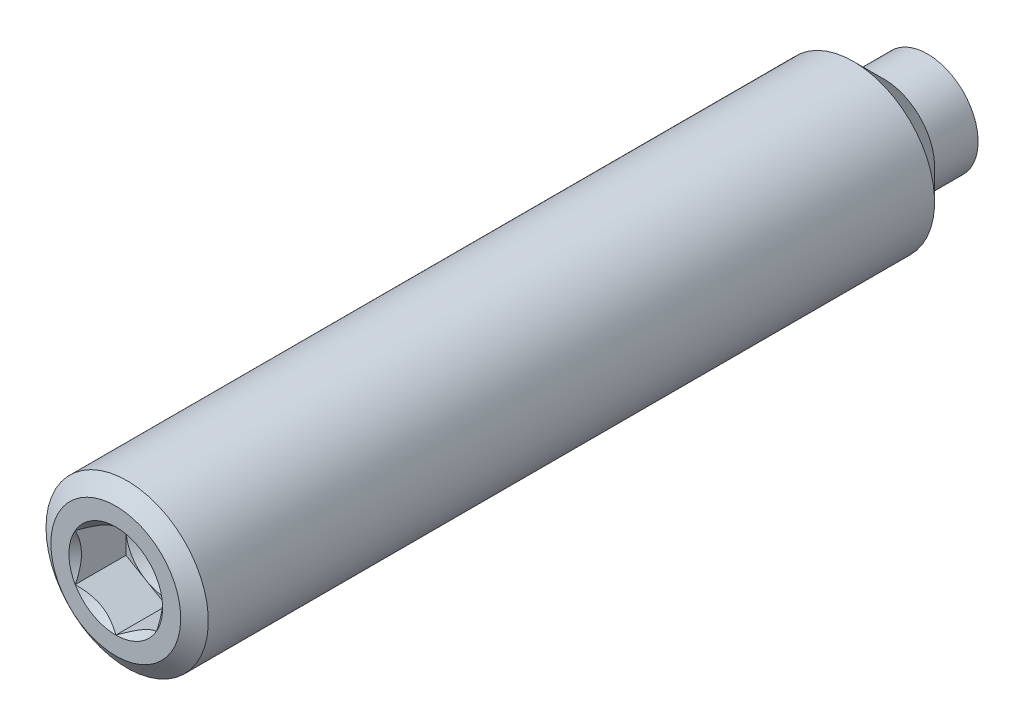
ISO-10303-21;
HEADER;
FILE_DESCRIPTION(('STEP AP214'),'2;1');
FILE_NAME('part.step','',(''),(''),'','','');
FILE_SCHEMA(('AUTOMOTIVE_DESIGN { 1 0 10303 214 1 1 1 1 }'));
ENDSEC;
DATA;
#1=APPLICATION_CONTEXT('core data for automotive mechanical design processes');
#2=APPLICATION_PROTOCOL_DEFINITION('international standard','automotive_design',2000,#1);
#3=PRODUCT_CONTEXT('',#1,'mechanical');
#4=PRODUCT('Part','Part','',(#3));
#5=PRODUCT_RELATED_PRODUCT_CATEGORY('part','',(#4));
#6=PRODUCT_DEFINITION_FORMATION('','',#4);
#7=PRODUCT_DEFINITION_CONTEXT('part definition',#1,'design');
#8=PRODUCT_DEFINITION('design','',#6,#7);
#9=PRODUCT_DEFINITION_SHAPE('','',#8);
#10=(LENGTH_UNIT() NAMED_UNIT(*) SI_UNIT(.MILLI.,.METRE.));
#11=(NAMED_UNIT(*) PLANE_ANGLE_UNIT() SI_UNIT($,.RADIAN.));
#12=(NAMED_UNIT(*) SI_UNIT($,.STERADIAN.) SOLID_ANGLE_UNIT());
#13=UNCERTAINTY_MEASURE_WITH_UNIT(LENGTH_MEASURE(1.E-05),#10,'distance_accuracy_value','');
#14=(GEOMETRIC_REPRESENTATION_CONTEXT(3) GLOBAL_UNCERTAINTY_ASSIGNED_CONTEXT((#13)) GLOBAL_UNIT_ASSIGNED_CONTEXT((#10,
#11,#12)) REPRESENTATION_CONTEXT('',''));
#15=CARTESIAN_POINT('',(0.,0.,0.));
#16=DIRECTION('',(0.,0.,1.));
#17=DIRECTION('',(1.,0.,0.));
#18=AXIS2_PLACEMENT_3D('',#15,#16,#17);
#19=CARTESIAN_POINT('',(0.,1.83308710467706,13.890625));
#20=DIRECTION('',(0.,0.,1.));
#21=DIRECTION('',(1.,0.,0.));
#22=AXIS2_PLACEMENT_3D('',#19,#20,#21);
#23=PLANE('',#22);
#24=CARTESIAN_POINT('',(0.,0.,13.890625));
#25=DIRECTION('',(0.,0.,1.));
#26=DIRECTION('',(1.,0.,0.));
#27=AXIS2_PLACEMENT_3D('',#24,#25,#26);
#28=CIRCLE('',#27,1.5875);
#29=CARTESIAN_POINT('',(1.5875,0.,13.890625));
#30=VERTEX_POINT('',#29);
#31=CARTESIAN_POINT('',(0.79375,1.3748153285078,13.890625));
#32=VERTEX_POINT('',#31);
#33=EDGE_CURVE('E120',#30,#32,#28,.T.);
#34=ORIENTED_EDGE('',*,*,#33,.F.);
#35=DIRECTION('',(0.,1.,0.));
#36=VECTOR('',#35,1.);
#37=CARTESIAN_POINT('',(1.5875,-0.916543552338533,13.890625));
#38=LINE('',#37,#36);
#39=CARTESIAN_POINT('',(1.5875,0.91654355233853,13.890625));
#40=VERTEX_POINT('',#39);
#41=EDGE_CURVE('E147',#30,#40,#38,.T.);
#42=ORIENTED_EDGE('',*,*,#41,.T.);
#43=DIRECTION('',(-0.866025403784439,0.5,0.));
#44=VECTOR('',#43,1.);
#45=CARTESIAN_POINT('',(1.5875,0.91654355233853,13.890625));
#46=LINE('',#45,#44);
#47=EDGE_CURVE('E141',#40,#32,#46,.T.);
#48=ORIENTED_EDGE('',*,*,#47,.T.);
#49=EDGE_LOOP('',(#34,#42,#48));
#50=FACE_BOUND('',#49,.T.);
#51=ADVANCED_FACE('F37',(#50),#23,.T.);
#52=CARTESIAN_POINT('',(-0.79375,1.3748153285078,13.890625));
#53=VERTEX_POINT('',#52);
#54=EDGE_CURVE('E122',#32,#53,#28,.T.);
#55=ORIENTED_EDGE('',*,*,#54,.F.);
#56=CARTESIAN_POINT('',(0.,1.83308710467706,13.890625));
#57=VERTEX_POINT('',#56);
#58=EDGE_CURVE('E133',#32,#57,#46,.T.);
#59=ORIENTED_EDGE('',*,*,#58,.T.);
#60=DIRECTION('',(-0.866025403784439,-0.5,0.));
#61=VECTOR('',#60,1.);
#62=CARTESIAN_POINT('',(0.,1.83308710467706,13.890625));
#63=LINE('',#62,#61);
#64=EDGE_CURVE('E136',#57,#53,#63,.T.);
#65=ORIENTED_EDGE('',*,*,#64,.T.);
#66=EDGE_LOOP('',(#55,#59,#65));
#67=FACE_BOUND('',#66,.T.);
#68=ADVANCED_FACE('F132',(#67),#23,.T.);
#69=CARTESIAN_POINT('',(-1.5875,0.,13.890625));
#70=VERTEX_POINT('',#69);
#71=EDGE_CURVE('E137',#53,#70,#28,.T.);
#72=ORIENTED_EDGE('',*,*,#71,.F.);
#73=CARTESIAN_POINT('',(-1.5875,0.91654355233853,13.890625));
#74=VERTEX_POINT('',#73);
#75=EDGE_CURVE('E149',#53,#74,#63,.T.);
#76=ORIENTED_EDGE('',*,*,#75,.T.);
#77=DIRECTION('',(0.,-1.,0.));
#78=VECTOR('',#77,1.);
#79=CARTESIAN_POINT('',(-1.5875,0.91654355233853,13.890625));
#80=LINE('',#79,#78);
#81=EDGE_CURVE('E159',#74,#70,#80,.T.);
#82=ORIENTED_EDGE('',*,*,#81,.T.);
#83=EDGE_LOOP('',(#72,#76,#82));
#84=FACE_BOUND('',#83,.T.);
#85=ADVANCED_FACE('F221',(#84),#23,.T.);
#86=CARTESIAN_POINT('',(-0.79375,-1.3748153285078,13.890625));
#87=VERTEX_POINT('',#86);
#88=EDGE_CURVE('E481',#70,#87,#28,.T.);
#89=ORIENTED_EDGE('',*,*,#88,.F.);
#90=CARTESIAN_POINT('',(-1.5875,-0.916543552338532,13.890625));
#91=VERTEX_POINT('',#90);
#92=EDGE_CURVE('E158',#70,#91,#80,.T.);
#93=ORIENTED_EDGE('',*,*,#92,.T.);
#94=DIRECTION('',(0.866025403784439,-0.5,0.));
#95=VECTOR('',#94,1.);
#96=CARTESIAN_POINT('',(-1.5875,-0.916543552338532,13.890625));
#97=LINE('',#96,#95);
#98=EDGE_CURVE('E163',#91,#87,#97,.T.);
#99=ORIENTED_EDGE('',*,*,#98,.T.);
#100=EDGE_LOOP('',(#89,#93,#99));
#101=FACE_BOUND('',#100,.T.);
#102=ADVANCED_FACE('F212',(#101),#23,.T.);
#103=CARTESIAN_POINT('',(0.793749999999999,-1.3748153285078,13.890625));
#104=VERTEX_POINT('',#103);
#105=EDGE_CURVE('E57',#87,#104,#28,.T.);
#106=ORIENTED_EDGE('',*,*,#105,.F.);
#107=CARTESIAN_POINT('',(0.,-1.83308710467706,13.890625));
#108=VERTEX_POINT('',#107);
#109=EDGE_CURVE('E162',#87,#108,#97,.T.);
#110=ORIENTED_EDGE('',*,*,#109,.T.);
#111=DIRECTION('',(0.866025403784439,0.5,0.));
#112=VECTOR('',#111,1.);
#113=CARTESIAN_POINT('',(0.,-1.83308710467706,13.890625));
#114=LINE('',#113,#112);
#115=EDGE_CURVE('E167',#108,#104,#114,.T.);
#116=ORIENTED_EDGE('',*,*,#115,.T.);
#117=EDGE_LOOP('',(#106,#110,#116));
#118=FACE_BOUND('',#117,.T.);
#119=ADVANCED_FACE('F205',(#118),#23,.T.);
#120=CARTESIAN_POINT('',(0.,0.,15.875));
#121=DIRECTION('',(0.,0.,1.));
#122=DIRECTION('',(1.,0.,0.));
#123=AXIS2_PLACEMENT_3D('',#120,#121,#122);
#124=PLANE('',#123);
#125=CARTESIAN_POINT('',(0.,0.,15.875));
#126=DIRECTION('',(0.,0.,1.));
#127=DIRECTION('',(1.,0.,0.));
#128=AXIS2_PLACEMENT_3D('',#125,#126,#127);
#129=CIRCLE('',#128,1.83308710467706);
#130=CARTESIAN_POINT('',(1.5875,0.916543552338527,15.875));
#131=VERTEX_POINT('',#130);
#132=CARTESIAN_POINT('',(0.,1.83308710467706,15.875));
#133=VERTEX_POINT('',#132);
#134=EDGE_CURVE('E262',#131,#133,#129,.T.);
#135=ORIENTED_EDGE('',*,*,#134,.F.);
#136=CARTESIAN_POINT('',(1.5875,-0.916543552338533,15.875));
#137=VERTEX_POINT('',#136);
#138=EDGE_CURVE('E64',#137,#131,#129,.T.);
#139=ORIENTED_EDGE('',*,*,#138,.F.);
#140=CARTESIAN_POINT('',(0.,-1.83308710467706,15.875));
#141=VERTEX_POINT('',#140);
#142=EDGE_CURVE('E256',#141,#137,#129,.T.);
#143=ORIENTED_EDGE('',*,*,#142,.F.);
#144=CARTESIAN_POINT('',(-1.5875,-0.91654355233853,15.875));
#145=VERTEX_POINT('',#144);
#146=EDGE_CURVE('E258',#145,#141,#129,.T.);
#147=ORIENTED_EDGE('',*,*,#146,.F.);
#148=CARTESIAN_POINT('',(-1.5875,0.916543552338532,15.875));
#149=VERTEX_POINT('',#148);
#150=EDGE_CURVE('E261',#149,#145,#129,.T.);
#151=ORIENTED_EDGE('',*,*,#150,.F.);
#152=EDGE_CURVE('E265',#133,#149,#129,.T.);
#153=ORIENTED_EDGE('',*,*,#152,.F.);
#154=EDGE_LOOP('',(#135,#139,#143,#147,#151,#153));
#155=FACE_BOUND('',#154,.T.);
#156=CARTESIAN_POINT('',(0.,0.,15.875));
#157=DIRECTION('',(0.,0.,-1.));
#158=DIRECTION('',(-1.,0.,0.));
#159=AXIS2_PLACEMENT_3D('',#156,#157,#158);
#160=CIRCLE('',#159,2.54);
#161=CARTESIAN_POINT('',(-2.54,0.,15.875));
#162=VERTEX_POINT('',#161);
#163=EDGE_CURVE('E50',#162,#162,#160,.T.);
#164=ORIENTED_EDGE('',*,*,#163,.F.);
#165=EDGE_LOOP('',(#164));
#166=FACE_BOUND('',#165,.T.);
#167=ADVANCED_FACE('F39',(#155,#166),#124,.T.);
#168=CARTESIAN_POINT('',(0.,0.,15.4303682132368));
#169=DIRECTION('',(0.,0.,-1.));
#170=DIRECTION('',(-1.,0.,0.));
#171=AXIS2_PLACEMENT_3D('',#168,#169,#170);
#172=CONICAL_SURFACE('',#171,3.175,0.95993108859688);
#173=ORIENTED_EDGE('',*,*,#163,.T.);
#174=EDGE_LOOP('',(#173));
#175=FACE_BOUND('',#174,.T.);
#176=CARTESIAN_POINT('',(0.,0.,15.4303682132368));
#177=DIRECTION('',(0.,0.,-1.));
#178=DIRECTION('',(-1.,0.,0.));
#179=AXIS2_PLACEMENT_3D('',#176,#177,#178);
#180=CIRCLE('',#179,3.175);
#181=CARTESIAN_POINT('',(-3.175,0.,15.4303682132368));
#182=VERTEX_POINT('',#181);
#183=EDGE_CURVE('E196',#182,#182,#180,.T.);
#184=ORIENTED_EDGE('',*,*,#183,.F.);
#185=EDGE_LOOP('',(#184));
#186=FACE_BOUND('',#185,.T.);
#187=ADVANCED_FACE('F201',(#175,#186),#172,.T.);
#188=CARTESIAN_POINT('',(0.,0.,-15.875));
#189=DIRECTION('',(0.,0.,-1.));
#190=DIRECTION('',(-1.,0.,0.));
#191=AXIS2_PLACEMENT_3D('',#188,#189,#190);
#192=CYLINDRICAL_SURFACE('',#191,3.175);
#193=ORIENTED_EDGE('',*,*,#183,.T.);
#194=EDGE_LOOP('',(#193));
#195=FACE_BOUND('',#194,.T.);
#196=CARTESIAN_POINT('',(0.,0.,-12.9794));
#197=DIRECTION('',(0.,0.,-1.));
#198=DIRECTION('',(-1.,0.,0.));
#199=AXIS2_PLACEMENT_3D('',#196,#197,#198);
#200=CIRCLE('',#199,3.175);
#201=CARTESIAN_POINT('',(-3.175,0.,-12.9794));
#202=VERTEX_POINT('',#201);
#203=EDGE_CURVE('E193',#202,#202,#200,.T.);
#204=ORIENTED_EDGE('',*,*,#203,.F.);
#205=EDGE_LOOP('',(#204));
#206=FACE_BOUND('',#205,.T.);
#207=ADVANCED_FACE('F211',(#195,#206),#192,.T.);
#208=CARTESIAN_POINT('',(0.,0.,-14.1732));
#209=DIRECTION('',(0.,0.,1.));
#210=DIRECTION('',(1.,0.,0.));
#211=AXIS2_PLACEMENT_3D('',#208,#209,#210);
#212=CONICAL_SURFACE('',#211,1.9812,0.785398163397454);
#213=ORIENTED_EDGE('',*,*,#203,.T.);
#214=EDGE_LOOP('',(#213));
#215=FACE_BOUND('',#214,.T.);
#216=CARTESIAN_POINT('',(0.,0.,-14.1732));
#217=DIRECTION('',(0.,0.,-1.));
#218=DIRECTION('',(-1.,0.,0.));
#219=AXIS2_PLACEMENT_3D('',#216,#217,#218);
#220=CIRCLE('',#219,1.9812);
#221=CARTESIAN_POINT('',(-1.9812,0.,-14.1732));
#222=VERTEX_POINT('',#221);
#223=EDGE_CURVE('E190',#222,#222,#220,.T.);
#224=ORIENTED_EDGE('',*,*,#223,.F.);
#225=EDGE_LOOP('',(#224));
#226=FACE_BOUND('',#225,.T.);
#227=ADVANCED_FACE('F295',(#215,#226),#212,.T.);
#228=CARTESIAN_POINT('',(0.,0.,-15.875));
#229=DIRECTION('',(0.,0.,-1.));
#230=DIRECTION('',(-1.,0.,0.));
#231=AXIS2_PLACEMENT_3D('',#228,#229,#230);
#232=CYLINDRICAL_SURFACE('',#231,1.9812);
#233=ORIENTED_EDGE('',*,*,#223,.T.);
#234=EDGE_LOOP('',(#233));
#235=FACE_BOUND('',#234,.T.);
#236=CARTESIAN_POINT('',(0.,0.,-15.875));
#237=DIRECTION('',(0.,0.,-1.));
#238=DIRECTION('',(-1.,0.,0.));
#239=AXIS2_PLACEMENT_3D('',#236,#237,#238);
#240=CIRCLE('',#239,1.9812);
#241=CARTESIAN_POINT('',(-1.9812,0.,-15.875));
#242=VERTEX_POINT('',#241);
#243=EDGE_CURVE('E175',#242,#242,#240,.T.);
#244=ORIENTED_EDGE('',*,*,#243,.F.);
#245=EDGE_LOOP('',(#244));
#246=FACE_BOUND('',#245,.T.);
#247=ADVANCED_FACE('F291',(#235,#246),#232,.T.);
#248=CARTESIAN_POINT('',(0.,1.9812,-15.875));
#249=DIRECTION('',(0.,0.,-1.));
#250=DIRECTION('',(-1.,0.,0.));
#251=AXIS2_PLACEMENT_3D('',#248,#249,#250);
#252=PLANE('',#251);
#253=ORIENTED_EDGE('',*,*,#243,.T.);
#254=EDGE_LOOP('',(#253));
#255=FACE_BOUND('',#254,.T.);
#256=ADVANCED_FACE('F288',(#255),#252,.T.);
#257=CARTESIAN_POINT('',(0.,0.,15.875));
#258=DIRECTION('',(0.,0.,1.));
#259=DIRECTION('',(1.,0.,0.));
#260=AXIS2_PLACEMENT_3D('',#257,#258,#259);
#261=CONICAL_SURFACE('',#260,1.83308710467706,0.78539816339745);
#262=ORIENTED_EDGE('',*,*,#152,.T.);
#263=CARTESIAN_POINT('',(0.000199999999999876,1.8332025747309,15.8751154809637));
#264=CARTESIAN_POINT('',(-0.0543752080991364,1.80169356364378,15.8436308083706));
#265=CARTESIAN_POINT('',(-0.10986303679029,1.7696576508122,15.8139950460135));
#266=CARTESIAN_POINT('',(-0.223009120846359,1.70433272872467,15.7597322600208));
#267=CARTESIAN_POINT('',(-0.280678141129382,1.67103750434037,15.7351354351332));
#268=CARTESIAN_POINT('',(-0.396965021873105,1.60389924243976,15.6930003642726));
#269=CARTESIAN_POINT('',(-0.455553255255933,1.57007331012484,15.6753561927298));
#270=CARTESIAN_POINT('',(-0.574019773254432,1.50167663406845,15.648171470085));
#271=CARTESIAN_POINT('',(-0.633894437016106,1.46710798082801,15.6386106206951));
#272=CARTESIAN_POINT('',(-0.737081228123443,1.40753305920537,15.629984413104));
#273=CARTESIAN_POINT('',(-0.780259984047713,1.38260379284922,15.6287071928096));
#274=CARTESIAN_POINT('',(-0.866546961464602,1.33278598321002,15.6308570558147));
#275=CARTESIAN_POINT('',(-0.909655152921389,1.30789745726817,15.6342857885493));
#276=CARTESIAN_POINT('',(-0.99545366499797,1.25836166322468,15.6456509944333));
#277=CARTESIAN_POINT('',(-1.03814359107459,1.23371462291266,15.6535913718016));
#278=CARTESIAN_POINT('',(-1.12280693652164,1.18483421762831,15.6735484144511));
#279=CARTESIAN_POINT('',(-1.16478004024493,1.16060103489495,15.6855668292087));
#280=CARTESIAN_POINT('',(-1.27228854188643,1.09853097253205,15.7212468972472));
#281=CARTESIAN_POINT('',(-1.3371572282911,1.06107901897434,15.7475985723031));
#282=CARTESIAN_POINT('',(-1.43253840061908,1.00601067345516,15.7920835368517));
#283=CARTESIAN_POINT('',(-1.46396930046384,0.987864034968913,15.8077128578011));
#284=CARTESIAN_POINT('',(-1.52625301443036,0.951904515944213,15.8403984878611));
#285=CARTESIAN_POINT('',(-1.55710609603942,0.934091480971892,15.857454115657));
#286=CARTESIAN_POINT('',(-1.5877,0.916428082284692,15.8751154809637));
#287=B_SPLINE_CURVE_WITH_KNOTS('',3,(#263,#264,#265,#266,#267,#268,#269,#270,#271,#272,#273,
#274,#275,#276,#277,#278,#279,#280,#281,#282,#283,#284,#285,#286),.UNSPECIFIED.,.F.,.F.,(4,2,2,
2,2,2,2,2,2,2,2,4),(0.,0.211482650810817,0.424197870807277,0.633533884524818,0.842342653263349,
0.991755553727141,1.14122083674205,1.29081565918877,1.44047473906438,1.6781878086972,
1.79671410024894,1.91518409436631),.UNSPECIFIED.);
#288=EDGE_CURVE('E11',#133,#149,#287,.T.);
#289=ORIENTED_EDGE('',*,*,#288,.F.);
#290=EDGE_LOOP('',(#262,#289));
#291=FACE_BOUND('',#290,.T.);
#292=ADVANCED_FACE('F235',(#291),#261,.F.);
#293=ORIENTED_EDGE('',*,*,#150,.T.);
#294=CARTESIAN_POINT('',(-1.5875,-1.82796193726258,16.4629872630533));
#295=CARTESIAN_POINT('',(-1.5875,-1.78345227615058,16.4293866524824));
#296=CARTESIAN_POINT('',(-1.5875,-1.73869460859013,16.3961154951128));
#297=CARTESIAN_POINT('',(-1.5875,-1.64858256596372,16.3303681176639));
#298=CARTESIAN_POINT('',(-1.5875,-1.60322804392557,16.2978920992359));
#299=CARTESIAN_POINT('',(-1.5875,-1.46545441976761,16.2013976119854));
#300=CARTESIAN_POINT('',(-1.5875,-1.372001913425,16.13883016346));
#301=CARTESIAN_POINT('',(-1.5875,-1.17603564989744,16.016002804435));
#302=CARTESIAN_POINT('',(-1.5875,-1.07330915468727,15.9560784496591));
#303=CARTESIAN_POINT('',(-1.5875,-0.8627251910833,15.8464640326728));
#304=CARTESIAN_POINT('',(-1.5875,-0.754886591626394,15.7967394689649));
#305=CARTESIAN_POINT('',(-1.5875,-0.593019911814793,15.7359060740893));
#306=CARTESIAN_POINT('',(-1.5875,-0.541388281953344,15.7184464520431));
#307=CARTESIAN_POINT('',(-1.5875,-0.43687853964485,15.6876723678477));
#308=CARTESIAN_POINT('',(-1.5875,-0.38400034159642,15.674358191262));
#309=CARTESIAN_POINT('',(-1.5875,-0.278196924179272,15.652788305472));
#310=CARTESIAN_POINT('',(-1.5875,-0.225289653780157,15.6444459279895));
#311=CARTESIAN_POINT('',(-1.5875,-0.118909299444436,15.6329825177005));
#312=CARTESIAN_POINT('',(-1.5875,-0.0654363143610312,15.6298605873549));
#313=CARTESIAN_POINT('',(-1.5875,0.0396125417767728,15.6290696410921));
#314=CARTESIAN_POINT('',(-1.5875,0.0911870236203157,15.6312073430156));
#315=CARTESIAN_POINT('',(-1.5875,0.193894009138674,15.6403913684824));
#316=CARTESIAN_POINT('',(-1.5875,0.245026469388833,15.647438168875));
#317=CARTESIAN_POINT('',(-1.5875,0.347344844875251,15.6661752166964));
#318=CARTESIAN_POINT('',(-1.5875,0.398516068928429,15.6779444835804));
#319=CARTESIAN_POINT('',(-1.5875,0.49974044612459,15.7055009465349));
#320=CARTESIAN_POINT('',(-1.5875,0.549793692439815,15.72128780641));
#321=CARTESIAN_POINT('',(-1.5875,0.707380774187259,15.7769297783058));
#322=CARTESIAN_POINT('',(-1.5875,0.812671634229882,15.8231218625745));
#323=CARTESIAN_POINT('',(-1.5875,1.01830702558101,15.9258243359444));
#324=CARTESIAN_POINT('',(-1.5875,1.11863208625861,15.9823717955531));
#325=CARTESIAN_POINT('',(-1.5875,1.3103677282283,16.0990341933715));
#326=CARTESIAN_POINT('',(-1.5875,1.40197355475198,16.1588322160727));
#327=CARTESIAN_POINT('',(-1.5875,1.53693633949296,16.2512738025041));
#328=CARTESIAN_POINT('',(-1.5875,1.58134147344183,16.2824136279364));
#329=CARTESIAN_POINT('',(-1.5875,1.66954488852479,16.3455168197706));
#330=CARTESIAN_POINT('',(-1.5875,1.7133433331845,16.3774799573449));
#331=CARTESIAN_POINT('',(-1.5875,1.75688919237298,16.4097844890283));
#332=B_SPLINE_CURVE_WITH_KNOTS('',3,(#294,#295,#296,#297,#298,#299,#300,#301,#302,#303,#304,
#305,#306,#307,#308,#309,#310,#311,#312,#313,#314,#315,#316,#317,#318,#319,#320,#321,#322,#323,
#324,#325,#326,#327,#328,#329,#330,#331),.UNSPECIFIED.,.F.,.F.,(4,2,2,2,2,2,2,2,2,2,2,2,2,2,2,2,
2,2,4),(0.,0.167300856006656,0.334643709885255,0.671883358358864,1.02837224619093,
1.38363464340873,1.54700775526169,1.7103921187555,1.87083807337658,2.03125644006703,
2.18586834446827,2.34049526931701,2.49782525404181,2.65514207759267,2.99906299922329,
3.34424006226481,3.67226428573992,3.83496498308972,3.99762093796191),.UNSPECIFIED.);
#333=EDGE_CURVE('E264',#149,#145,#332,.F.);
#334=ORIENTED_EDGE('',*,*,#333,.F.);
#335=EDGE_LOOP('',(#293,#334));
#336=FACE_BOUND('',#335,.T.);
#337=ADVANCED_FACE('F331',(#336),#261,.F.);
#338=ORIENTED_EDGE('',*,*,#146,.T.);
#339=CARTESIAN_POINT('',(-1.5877,-0.916428082284695,15.8751154809637));
#340=CARTESIAN_POINT('',(-1.53312479190086,-0.947937093371811,15.8436308083706));
#341=CARTESIAN_POINT('',(-1.47763696320971,-0.979973006203396,15.8139950460135));
#342=CARTESIAN_POINT('',(-1.36449087915364,-1.04529792829092,15.7597322600208));
#343=CARTESIAN_POINT('',(-1.30682185887062,-1.07859315267522,15.7351354351332));
#344=CARTESIAN_POINT('',(-1.1905349781269,-1.14573141457583,15.6930003642726));
#345=CARTESIAN_POINT('',(-1.13194674474407,-1.17955734689075,15.6753561927298));
#346=CARTESIAN_POINT('',(-1.01348022674557,-1.24795402294715,15.648171470085));
#347=CARTESIAN_POINT('',(-0.953605562983895,-1.28252267618759,15.6386106206951));
#348=CARTESIAN_POINT('',(-0.850418771876557,-1.34209759781022,15.629984413104));
#349=CARTESIAN_POINT('',(-0.807240015952288,-1.36702686416637,15.6287071928096));
#350=CARTESIAN_POINT('',(-0.720953038535398,-1.41684467380557,15.6308570558147));
#351=CARTESIAN_POINT('',(-0.677844847078612,-1.44173319974743,15.6342857885493));
#352=CARTESIAN_POINT('',(-0.592046335002031,-1.49126899379091,15.6456509944333));
#353=CARTESIAN_POINT('',(-0.549356408925407,-1.51591603410293,15.6535913718016));
#354=CARTESIAN_POINT('',(-0.464693063478359,-1.56479643938728,15.6735484144511));
#355=CARTESIAN_POINT('',(-0.422719959755075,-1.58902962212064,15.6855668292087));
#356=CARTESIAN_POINT('',(-0.315211458113566,-1.65109968448354,15.7212468972472));
#357=CARTESIAN_POINT('',(-0.250342771708901,-1.68855163804125,15.7475985723031));
#358=CARTESIAN_POINT('',(-0.154961599380925,-1.74361998356043,15.7920835368517));
#359=CARTESIAN_POINT('',(-0.123530699536158,-1.76176662204668,15.8077128578011));
#360=CARTESIAN_POINT('',(-0.0612469855696381,-1.79772614107138,15.8403984878611));
#361=CARTESIAN_POINT('',(-0.0303939039605775,-1.8155391760437,15.857454115657));
#362=CARTESIAN_POINT('',(0.000199999999999142,-1.8332025747309,15.8751154809637));
#363=B_SPLINE_CURVE_WITH_KNOTS('',3,(#339,#340,#341,#342,#343,#344,#345,#346,#347,#348,#349,
#350,#351,#352,#353,#354,#355,#356,#357,#358,#359,#360,#361,#362),.UNSPECIFIED.,.F.,.F.,(4,2,2,
2,2,2,2,2,2,2,2,4),(0.,0.211482650810815,0.424197870807275,0.633533884524816,0.842342653263348,
0.991755553727141,1.14122083674205,1.29081565918877,1.44047473906438,1.6781878086972,
1.79671410024894,1.91518409436631),.UNSPECIFIED.);
#364=EDGE_CURVE('E250',#145,#141,#363,.T.);
#365=ORIENTED_EDGE('',*,*,#364,.F.);
#366=EDGE_LOOP('',(#338,#365));
#367=FACE_BOUND('',#366,.T.);
#368=ADVANCED_FACE('F338',(#367),#261,.F.);
#369=ORIENTED_EDGE('',*,*,#142,.T.);
#370=CARTESIAN_POINT('',(-0.000200000000000659,-1.8332025747309,15.8751154809637));
#371=CARTESIAN_POINT('',(0.054375208099136,-1.80169356364378,15.8436308083706));
#372=CARTESIAN_POINT('',(0.109863036790289,-1.7696576508122,15.8139950460135));
#373=CARTESIAN_POINT('',(0.223009120846358,-1.70433272872468,15.7597322600208));
#374=CARTESIAN_POINT('',(0.28067814112938,-1.67103750434037,15.7351354351332));
#375=CARTESIAN_POINT('',(0.396965021873102,-1.60389924243976,15.6930003642726));
#376=CARTESIAN_POINT('',(0.45555325525593,-1.57007331012484,15.6753561927298));
#377=CARTESIAN_POINT('',(0.574019773254431,-1.50167663406845,15.648171470085));
#378=CARTESIAN_POINT('',(0.633894437016105,-1.46710798082801,15.6386106206951));
#379=CARTESIAN_POINT('',(0.737081228123443,-1.40753305920537,15.629984413104));
#380=CARTESIAN_POINT('',(0.780259984047713,-1.38260379284922,15.6287071928096));
#381=CARTESIAN_POINT('',(0.866546961464603,-1.33278598321002,15.6308570558147));
#382=CARTESIAN_POINT('',(0.909655152921389,-1.30789745726817,15.6342857885493));
#383=CARTESIAN_POINT('',(0.99545366499797,-1.25836166322469,15.6456509944333));
#384=CARTESIAN_POINT('',(1.03814359107459,-1.23371462291266,15.6535913718016));
#385=CARTESIAN_POINT('',(1.12280693652164,-1.18483421762831,15.6735484144511));
#386=CARTESIAN_POINT('',(1.16478004024493,-1.16060103489495,15.6855668292087));
#387=CARTESIAN_POINT('',(1.27228854188643,-1.09853097253205,15.7212468972472));
#388=CARTESIAN_POINT('',(1.3371572282911,-1.06107901897434,15.7475985723031));
#389=CARTESIAN_POINT('',(1.43253840061907,-1.00601067345517,15.7920835368517));
#390=CARTESIAN_POINT('',(1.46396930046384,-0.987864034968916,15.8077128578011));
#391=CARTESIAN_POINT('',(1.52625301443036,-0.951904515944217,15.8403984878611));
#392=CARTESIAN_POINT('',(1.55710609603942,-0.934091480971896,15.857454115657));
#393=CARTESIAN_POINT('',(1.5877,-0.916428082284696,15.8751154809637));
#394=B_SPLINE_CURVE_WITH_KNOTS('',3,(#370,#371,#372,#373,#374,#375,#376,#377,#378,#379,#380,
#381,#382,#383,#384,#385,#386,#387,#388,#389,#390,#391,#392,#393),.UNSPECIFIED.,.F.,.F.,(4,2,2,
2,2,2,2,2,2,2,2,4),(0.,0.211482650810815,0.424197870807275,0.633533884524816,0.84234265326335,
0.991755553727143,1.14122083674205,1.29081565918877,1.44047473906438,1.6781878086972,
1.79671410024894,1.91518409436631),.UNSPECIFIED.);
#395=EDGE_CURVE('E253',#141,#137,#394,.T.);
#396=ORIENTED_EDGE('',*,*,#395,.F.);
#397=EDGE_LOOP('',(#369,#396));
#398=FACE_BOUND('',#397,.T.);
#399=ADVANCED_FACE('F345',(#398),#261,.F.);
#400=ORIENTED_EDGE('',*,*,#138,.T.);
#401=CARTESIAN_POINT('',(1.5875,-1.82796193752854,16.4629872632541));
#402=CARTESIAN_POINT('',(1.5875,-1.78345227640908,16.4293866526755));
#403=CARTESIAN_POINT('',(1.5875,-1.73869460884114,16.3961154952982));
#404=CARTESIAN_POINT('',(1.5875,-1.64858256619968,16.3303681178338));
#405=CARTESIAN_POINT('',(1.5875,-1.60322804415397,16.2978920993982));
#406=CARTESIAN_POINT('',(1.5875,-1.46545441997287,16.2013976121245));
#407=CARTESIAN_POINT('',(1.5875,-1.37200191361453,16.1388301635837));
#408=CARTESIAN_POINT('',(1.5875,-1.17603565005265,16.016002804527));
#409=CARTESIAN_POINT('',(1.5875,-1.0733091548238,15.956078449735));
#410=CARTESIAN_POINT('',(1.5875,-0.862725191180889,15.8464640327188));
#411=CARTESIAN_POINT('',(1.5875,-0.754886591703732,15.7967394689971));
#412=CARTESIAN_POINT('',(1.5875,-0.593019911876896,15.7359060741112));
#413=CARTESIAN_POINT('',(1.5875,-0.541388282021828,15.7184464520654));
#414=CARTESIAN_POINT('',(1.5875,-0.436878539726303,15.6876723678696));
#415=CARTESIAN_POINT('',(1.5875,-0.384000341684463,15.6743581912829));
#416=CARTESIAN_POINT('',(1.5875,-0.278196924280277,15.6527883054897));
#417=CARTESIAN_POINT('',(1.5875,-0.22528965388753,15.6444459280048));
#418=CARTESIAN_POINT('',(1.5875,-0.118909299564333,15.6329825177097));
#419=CARTESIAN_POINT('',(1.5875,-0.0654363144870847,15.6298605873603));
#420=CARTESIAN_POINT('',(1.5875,0.0396125416393619,15.6290696410889));
#421=CARTESIAN_POINT('',(1.5875,0.0911870234776872,15.6312073430076));
#422=CARTESIAN_POINT('',(1.5875,0.193894008986132,15.640391368464));
#423=CARTESIAN_POINT('',(1.5875,0.245026469231596,15.6474381688511));
#424=CARTESIAN_POINT('',(1.5875,0.347344844708745,15.6661752166609));
#425=CARTESIAN_POINT('',(1.5875,0.398516068757362,15.6779444835388));
#426=CARTESIAN_POINT('',(1.5875,0.499740445944843,15.705500946481));
#427=CARTESIAN_POINT('',(1.5875,0.549793692255948,15.7212878063498));
#428=CARTESIAN_POINT('',(1.5875,0.707380773963355,15.7769297782163));
#429=CARTESIAN_POINT('',(1.5875,0.812671633972069,15.8231218624579));
#430=CARTESIAN_POINT('',(1.5875,1.01830702525798,15.9258243357708));
#431=CARTESIAN_POINT('',(1.5875,1.11863208590429,15.9823717953494));
#432=CARTESIAN_POINT('',(1.5875,1.31036772781772,16.0990341931104));
#433=CARTESIAN_POINT('',(1.5875,1.40197355431623,16.1588322157844));
#434=CARTESIAN_POINT('',(1.5875,1.53693633902,16.2512738021751));
#435=CARTESIAN_POINT('',(1.5875,1.58134147295665,16.282413627594));
#436=CARTESIAN_POINT('',(1.5875,1.66954488801523,16.3455168194013));
#437=CARTESIAN_POINT('',(1.5875,1.7133433326628,16.3774799569622));
#438=CARTESIAN_POINT('',(1.5875,1.75688919183915,16.4097844886323));
#439=B_SPLINE_CURVE_WITH_KNOTS('',3,(#401,#402,#403,#404,#405,#406,#407,#408,#409,#410,#411,
#412,#413,#414,#415,#416,#417,#418,#419,#420,#421,#422,#423,#424,#425,#426,#427,#428,#429,#430,
#431,#432,#433,#434,#435,#436,#437,#438),.UNSPECIFIED.,.F.,.F.,(4,2,2,2,2,2,2,2,2,2,2,2,2,2,2,2,
2,2,4),(0.,0.167300856038502,0.334643709948953,0.67188335848746,1.0283722463923,
1.38363464368218,1.54700775551669,1.71039211899209,1.8708380735955,2.03125644026828,
2.18586834465335,2.34049526948591,2.49782525419329,2.65514207772673,2.99906299923216,
3.34424006214766,3.67226428551494,3.83496498281157,3.99762093763058),.UNSPECIFIED.);
#440=EDGE_CURVE('E464',#137,#131,#439,.T.);
#441=ORIENTED_EDGE('',*,*,#440,.F.);
#442=EDGE_LOOP('',(#400,#441));
#443=FACE_BOUND('',#442,.T.);
#444=ADVANCED_FACE('F233',(#443),#261,.F.);
#445=ORIENTED_EDGE('',*,*,#134,.T.);
#446=CARTESIAN_POINT('',(1.5877,0.916428082284692,15.8751154809637));
#447=CARTESIAN_POINT('',(1.53312479190086,0.947937093371808,15.8436308083706));
#448=CARTESIAN_POINT('',(1.47763696320971,0.979973006203393,15.8139950460135));
#449=CARTESIAN_POINT('',(1.36449087915364,1.04529792829092,15.7597322600208));
#450=CARTESIAN_POINT('',(1.30682185887062,1.07859315267522,15.7351354351332));
#451=CARTESIAN_POINT('',(1.1905349781269,1.14573141457583,15.6930003642726));
#452=CARTESIAN_POINT('',(1.13194674474407,1.17955734689075,15.6753561927298));
#453=CARTESIAN_POINT('',(1.01348022674557,1.24795402294714,15.648171470085));
#454=CARTESIAN_POINT('',(0.953605562983894,1.28252267618758,15.6386106206951));
#455=CARTESIAN_POINT('',(0.850418771876556,1.34209759781022,15.629984413104));
#456=CARTESIAN_POINT('',(0.807240015952286,1.36702686416637,15.6287071928096));
#457=CARTESIAN_POINT('',(0.720953038535397,1.41684467380557,15.6308570558147));
#458=CARTESIAN_POINT('',(0.677844847078611,1.44173319974742,15.6342857885493));
#459=CARTESIAN_POINT('',(0.592046335002029,1.49126899379091,15.6456509944333));
#460=CARTESIAN_POINT('',(0.549356408925405,1.51591603410293,15.6535913718016));
#461=CARTESIAN_POINT('',(0.464693063478357,1.56479643938728,15.6735484144511));
#462=CARTESIAN_POINT('',(0.422719959755073,1.58902962212064,15.6855668292087));
#463=CARTESIAN_POINT('',(0.315211458113565,1.65109968448354,15.7212468972472));
#464=CARTESIAN_POINT('',(0.250342771708899,1.68855163804125,15.7475985723031));
#465=CARTESIAN_POINT('',(0.154961599380923,1.74361998356043,15.7920835368517));
#466=CARTESIAN_POINT('',(0.123530699536156,1.76176662204668,15.8077128578011));
#467=CARTESIAN_POINT('',(0.061246985569637,1.79772614107138,15.8403984878611));
#468=CARTESIAN_POINT('',(0.0303939039605768,1.8155391760437,15.857454115657));
#469=CARTESIAN_POINT('',(-0.000199999999999639,1.8332025747309,15.8751154809637));
#470=B_SPLINE_CURVE_WITH_KNOTS('',3,(#446,#447,#448,#449,#450,#451,#452,#453,#454,#455,#456,
#457,#458,#459,#460,#461,#462,#463,#464,#465,#466,#467,#468,#469),.UNSPECIFIED.,.F.,.F.,(4,2,2,
2,2,2,2,2,2,2,2,4),(0.,0.211482650810817,0.424197870807277,0.633533884524816,0.842342653263349,
0.991755553727142,1.14122083674205,1.29081565918877,1.44047473906438,1.6781878086972,
1.79671410024894,1.91518409436631),.UNSPECIFIED.);
#471=EDGE_CURVE('E145',#131,#133,#470,.T.);
#472=ORIENTED_EDGE('',*,*,#471,.F.);
#473=EDGE_LOOP('',(#445,#472));
#474=FACE_BOUND('',#473,.T.);
#475=ADVANCED_FACE('F225',(#474),#261,.F.);
#476=EDGE_CURVE('E124',#104,#30,#28,.T.);
#477=ORIENTED_EDGE('',*,*,#476,.F.);
#478=CARTESIAN_POINT('',(1.5875,-0.916543552338533,13.890625));
#479=VERTEX_POINT('',#478);
#480=EDGE_CURVE('E166',#104,#479,#114,.T.);
#481=ORIENTED_EDGE('',*,*,#480,.T.);
#482=EDGE_CURVE('E170',#479,#30,#38,.T.);
#483=ORIENTED_EDGE('',*,*,#482,.T.);
#484=EDGE_LOOP('',(#477,#481,#483));
#485=FACE_BOUND('',#484,.T.);
#486=ADVANCED_FACE('F215',(#485),#23,.T.);
#487=CARTESIAN_POINT('',(0.,1.83308710467706,13.890625));
#488=DIRECTION('',(-0.5,0.866025403784439,0.));
#489=DIRECTION('',(-0.866025403784439,-0.5,0.));
#490=AXIS2_PLACEMENT_3D('',#487,#488,#489);
#491=PLANE('',#490);
#492=DIRECTION('',(0.,0.,1.));
#493=VECTOR('',#492,1.);
#494=CARTESIAN_POINT('',(0.,1.83308710467706,13.890625));
#495=LINE('',#494,#493);
#496=EDGE_CURVE('E144',#57,#133,#495,.T.);
#497=ORIENTED_EDGE('',*,*,#496,.T.);
#498=ORIENTED_EDGE('',*,*,#288,.T.);
#499=DIRECTION('',(0.,0.,1.));
#500=VECTOR('',#499,1.);
#501=CARTESIAN_POINT('',(-1.5875,0.91654355233853,13.890625));
#502=LINE('',#501,#500);
#503=EDGE_CURVE('E184',#74,#149,#502,.T.);
#504=ORIENTED_EDGE('',*,*,#503,.F.);
#505=ORIENTED_EDGE('',*,*,#75,.F.);
#506=ORIENTED_EDGE('',*,*,#64,.F.);
#507=EDGE_LOOP('',(#497,#498,#504,#505,#506));
#508=FACE_BOUND('',#507,.T.);
#509=ADVANCED_FACE('F224',(#508),#491,.F.);
#510=CARTESIAN_POINT('',(-1.5875,0.91654355233853,13.890625));
#511=DIRECTION('',(-1.,0.,0.));
#512=DIRECTION('',(0.,-1.,0.));
#513=AXIS2_PLACEMENT_3D('',#510,#511,#512);
#514=PLANE('',#513);
#515=ORIENTED_EDGE('',*,*,#503,.T.);
#516=ORIENTED_EDGE('',*,*,#333,.T.);
#517=DIRECTION('',(0.,0.,1.));
#518=VECTOR('',#517,1.);
#519=CARTESIAN_POINT('',(-1.5875,-0.916543552338532,13.890625));
#520=LINE('',#519,#518);
#521=EDGE_CURVE('E181',#91,#145,#520,.T.);
#522=ORIENTED_EDGE('',*,*,#521,.F.);
#523=ORIENTED_EDGE('',*,*,#92,.F.);
#524=ORIENTED_EDGE('',*,*,#81,.F.);
#525=EDGE_LOOP('',(#515,#516,#522,#523,#524));
#526=FACE_BOUND('',#525,.T.);
#527=ADVANCED_FACE('F231',(#526),#514,.F.);
#528=CARTESIAN_POINT('',(-1.5875,-0.916543552338532,13.890625));
#529=DIRECTION('',(-0.5,-0.866025403784438,0.));
#530=DIRECTION('',(0.866025403784439,-0.5,0.));
#531=AXIS2_PLACEMENT_3D('',#528,#529,#530);
#532=PLANE('',#531);
#533=ORIENTED_EDGE('',*,*,#521,.T.);
#534=ORIENTED_EDGE('',*,*,#364,.T.);
#535=DIRECTION('',(0.,0.,1.));
#536=VECTOR('',#535,1.);
#537=CARTESIAN_POINT('',(0.,-1.83308710467706,13.890625));
#538=LINE('',#537,#536);
#539=EDGE_CURVE('E178',#108,#141,#538,.T.);
#540=ORIENTED_EDGE('',*,*,#539,.F.);
#541=ORIENTED_EDGE('',*,*,#109,.F.);
#542=ORIENTED_EDGE('',*,*,#98,.F.);
#543=EDGE_LOOP('',(#533,#534,#540,#541,#542));
#544=FACE_BOUND('',#543,.T.);
#545=ADVANCED_FACE('F248',(#544),#532,.F.);
#546=CARTESIAN_POINT('',(0.,-1.83308710467706,13.890625));
#547=DIRECTION('',(0.5,-0.866025403784439,0.));
#548=DIRECTION('',(0.866025403784439,0.5,0.));
#549=AXIS2_PLACEMENT_3D('',#546,#547,#548);
#550=PLANE('',#549);
#551=ORIENTED_EDGE('',*,*,#539,.T.);
#552=ORIENTED_EDGE('',*,*,#395,.T.);
#553=DIRECTION('',(0.,0.,1.));
#554=VECTOR('',#553,1.);
#555=CARTESIAN_POINT('',(1.5875,-0.916543552338533,13.890625));
#556=LINE('',#555,#554);
#557=EDGE_CURVE('E176',#479,#137,#556,.T.);
#558=ORIENTED_EDGE('',*,*,#557,.F.);
#559=ORIENTED_EDGE('',*,*,#480,.F.);
#560=ORIENTED_EDGE('',*,*,#115,.F.);
#561=EDGE_LOOP('',(#551,#552,#558,#559,#560));
#562=FACE_BOUND('',#561,.T.);
#563=ADVANCED_FACE('F241',(#562),#550,.F.);
#564=CARTESIAN_POINT('',(1.5875,-0.916543552338533,13.890625));
#565=DIRECTION('',(1.,0.,0.));
#566=DIRECTION('',(0.,1.,0.));
#567=AXIS2_PLACEMENT_3D('',#564,#565,#566);
#568=PLANE('',#567);
#569=ORIENTED_EDGE('',*,*,#557,.T.);
#570=ORIENTED_EDGE('',*,*,#440,.T.);
#571=DIRECTION('',(0.,0.,1.));
#572=VECTOR('',#571,1.);
#573=CARTESIAN_POINT('',(1.5875,0.91654355233853,13.890625));
#574=LINE('',#573,#572);
#575=EDGE_CURVE('E173',#40,#131,#574,.T.);
#576=ORIENTED_EDGE('',*,*,#575,.F.);
#577=ORIENTED_EDGE('',*,*,#41,.F.);
#578=ORIENTED_EDGE('',*,*,#482,.F.);
#579=EDGE_LOOP('',(#569,#570,#576,#577,#578));
#580=FACE_BOUND('',#579,.T.);
#581=ADVANCED_FACE('F287',(#580),#568,.F.);
#582=CARTESIAN_POINT('',(1.5875,0.91654355233853,13.890625));
#583=DIRECTION('',(0.5,0.866025403784439,0.));
#584=DIRECTION('',(-0.866025403784439,0.5,0.));
#585=AXIS2_PLACEMENT_3D('',#582,#583,#584);
#586=PLANE('',#585);
#587=ORIENTED_EDGE('',*,*,#575,.T.);
#588=ORIENTED_EDGE('',*,*,#471,.T.);
#589=ORIENTED_EDGE('',*,*,#496,.F.);
#590=ORIENTED_EDGE('',*,*,#58,.F.);
#591=ORIENTED_EDGE('',*,*,#47,.F.);
#592=EDGE_LOOP('',(#587,#588,#589,#590,#591));
#593=FACE_BOUND('',#592,.T.);
#594=ADVANCED_FACE('F117',(#593),#586,.F.);
#595=CARTESIAN_POINT('',(0.,0.,13.890625));
#596=DIRECTION('',(0.,0.,1.));
#597=DIRECTION('',(1.,0.,0.));
#598=AXIS2_PLACEMENT_3D('',#595,#596,#597);
#599=CONICAL_SURFACE('',#598,1.5875,1.0471975511966);
#600=CARTESIAN_POINT('',(0.,0.,12.9740814476615));
#601=VERTEX_POINT('',#600);
#602=VERTEX_LOOP('',#601);
#603=FACE_BOUND('',#602,.T.);
#604=ORIENTED_EDGE('',*,*,#33,.T.);
#605=ORIENTED_EDGE('',*,*,#54,.T.);
#606=ORIENTED_EDGE('',*,*,#71,.T.);
#607=ORIENTED_EDGE('',*,*,#88,.T.);
#608=ORIENTED_EDGE('',*,*,#105,.T.);
#609=ORIENTED_EDGE('',*,*,#476,.T.);
#610=EDGE_LOOP('',(#604,#605,#606,#607,#608,#609));
#611=FACE_BOUND('',#610,.T.);
#612=ADVANCED_FACE('F115',(#603,#611),#599,.F.);
#613=CLOSED_SHELL('',(#51,#68,#85,#102,#119,#167,#187,#207,#227,#247,#256,#292,#337,#368,#399,
#444,#475,#486,#509,#527,#545,#563,#581,#594,#612));
#614=MANIFOLD_SOLID_BREP('B2',#613);
#615=ADVANCED_BREP_SHAPE_REPRESENTATION('',(#18,#614),#14);
#616=SHAPE_DEFINITION_REPRESENTATION(#9,#615);
ENDSEC;
END-ISO-10303-21;
